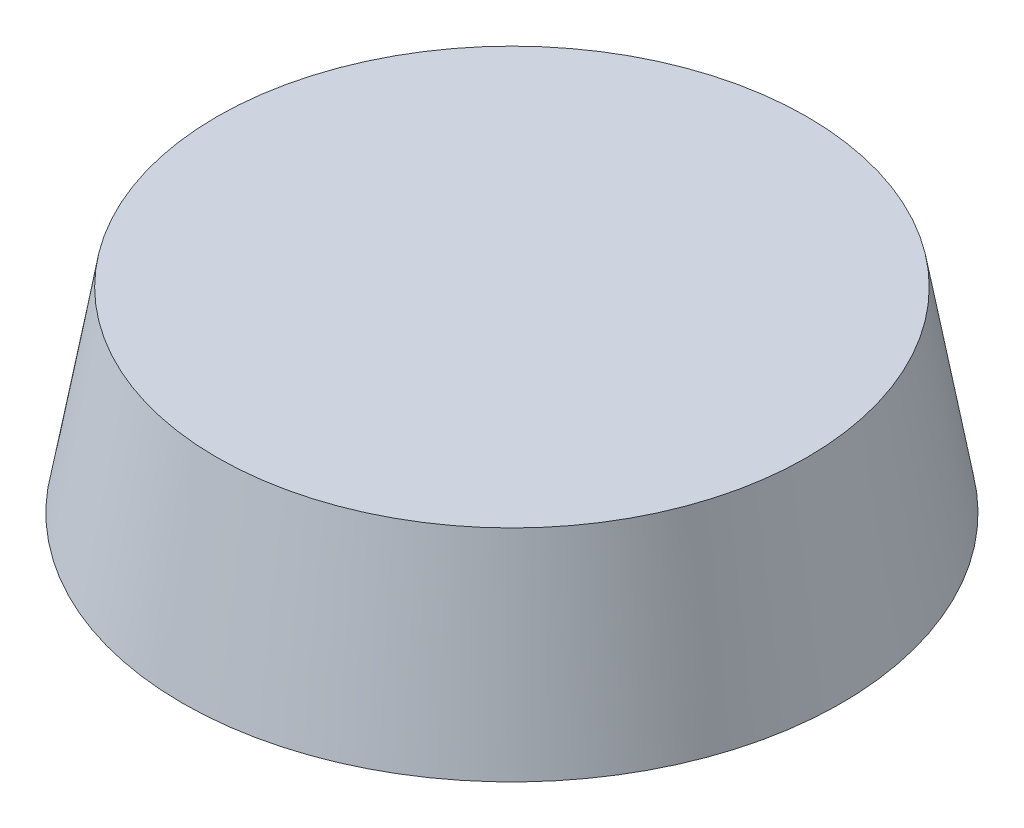
ISO-10303-21;
HEADER;
FILE_DESCRIPTION(('STEP AP214'),'2;1');
FILE_NAME('part.step','',(''),(''),'','','');
FILE_SCHEMA(('AUTOMOTIVE_DESIGN { 1 0 10303 214 1 1 1 1 }'));
ENDSEC;
DATA;
#1=APPLICATION_CONTEXT('core data for automotive mechanical design processes');
#2=APPLICATION_PROTOCOL_DEFINITION('international standard','automotive_design',2000,#1);
#3=PRODUCT_CONTEXT('',#1,'mechanical');
#4=PRODUCT('Part','Part','',(#3));
#5=PRODUCT_RELATED_PRODUCT_CATEGORY('part','',(#4));
#6=PRODUCT_DEFINITION_FORMATION('','',#4);
#7=PRODUCT_DEFINITION_CONTEXT('part definition',#1,'design');
#8=PRODUCT_DEFINITION('design','',#6,#7);
#9=PRODUCT_DEFINITION_SHAPE('','',#8);
#10=(LENGTH_UNIT() NAMED_UNIT(*) SI_UNIT(.MILLI.,.METRE.));
#11=(NAMED_UNIT(*) PLANE_ANGLE_UNIT() SI_UNIT($,.RADIAN.));
#12=(NAMED_UNIT(*) SI_UNIT($,.STERADIAN.) SOLID_ANGLE_UNIT());
#13=UNCERTAINTY_MEASURE_WITH_UNIT(LENGTH_MEASURE(1.E-05),#10,'distance_accuracy_value','');
#14=(GEOMETRIC_REPRESENTATION_CONTEXT(3) GLOBAL_UNCERTAINTY_ASSIGNED_CONTEXT((#13)) GLOBAL_UNIT_ASSIGNED_CONTEXT((#10,
#11,#12)) REPRESENTATION_CONTEXT('',''));
#15=CARTESIAN_POINT('',(0.,0.,0.));
#16=DIRECTION('',(0.,0.,1.));
#17=DIRECTION('',(1.,0.,0.));
#18=AXIS2_PLACEMENT_3D('',#15,#16,#17);
#19=CARTESIAN_POINT('',(0.,0.0868240888334607,0.));
#20=DIRECTION('',(0.,-1.,0.));
#21=DIRECTION('',(0.,0.,-1.));
#22=AXIS2_PLACEMENT_3D('',#19,#20,#21);
#23=PLANE('',#22);
#24=CARTESIAN_POINT('',(0.,0.0868240888334607,0.));
#25=DIRECTION('',(0.,-1.,0.));
#26=DIRECTION('',(0.,0.,-1.));
#27=AXIS2_PLACEMENT_3D('',#24,#25,#26);
#28=CIRCLE('',#27,11.9846905705632);
#29=CARTESIAN_POINT('',(0.,0.0868240888334607,-11.9846905705632));
#30=VERTEX_POINT('',#29);
#31=EDGE_CURVE('E36',#30,#30,#28,.F.);
#32=ORIENTED_EDGE('',*,*,#31,.T.);
#33=EDGE_LOOP('',(#32));
#34=FACE_BOUND('',#33,.T.);
#35=CARTESIAN_POINT('',(0.,0.0868240888334607,0.));
#36=DIRECTION('',(0.,1.,0.));
#37=DIRECTION('',(0.,0.,1.));
#38=AXIS2_PLACEMENT_3D('',#35,#36,#37);
#39=CIRCLE('',#38,12.4924038765061);
#40=CARTESIAN_POINT('',(0.,0.0868240888334607,12.4924038765061));
#41=VERTEX_POINT('',#40);
#42=EDGE_CURVE('E11',#41,#41,#39,.T.);
#43=ORIENTED_EDGE('',*,*,#42,.F.);
#44=EDGE_LOOP('',(#43));
#45=FACE_BOUND('',#44,.T.);
#46=ADVANCED_FACE('F32',(#34,#45),#23,.T.);
#47=CARTESIAN_POINT('',(0.,7.5,0.));
#48=DIRECTION('',(0.,1.,0.));
#49=DIRECTION('',(0.,0.,1.));
#50=AXIS2_PLACEMENT_3D('',#47,#48,#49);
#51=PLANE('',#50);
#52=CARTESIAN_POINT('',(0.,7.5,0.));
#53=DIRECTION('',(0.,1.,0.));
#54=DIRECTION('',(0.,0.,1.));
#55=AXIS2_PLACEMENT_3D('',#52,#53,#54);
#56=CIRCLE('',#55,11.1852609506294);
#57=CARTESIAN_POINT('',(0.,7.5,11.1852609506294));
#58=VERTEX_POINT('',#57);
#59=EDGE_CURVE('E44',#58,#58,#56,.T.);
#60=ORIENTED_EDGE('',*,*,#59,.T.);
#61=EDGE_LOOP('',(#60));
#62=FACE_BOUND('',#61,.T.);
#63=ADVANCED_FACE('F65',(#62),#51,.T.);
#64=CARTESIAN_POINT('',(0.,7.5,0.));
#65=DIRECTION('',(0.,-1.,0.));
#66=DIRECTION('',(0.,0.,-1.));
#67=AXIS2_PLACEMENT_3D('',#64,#65,#66);
#68=CONICAL_SURFACE('',#67,11.1852609506294,0.174532925199429);
#69=ORIENTED_EDGE('',*,*,#42,.T.);
#70=EDGE_LOOP('',(#69));
#71=FACE_BOUND('',#70,.T.);
#72=ORIENTED_EDGE('',*,*,#59,.F.);
#73=EDGE_LOOP('',(#72));
#74=FACE_BOUND('',#73,.T.);
#75=ADVANCED_FACE('F57',(#71,#74),#68,.T.);
#76=CARTESIAN_POINT('',(0.,7.,0.));
#77=DIRECTION('',(0.,-1.,0.));
#78=DIRECTION('',(0.,0.,-1.));
#79=AXIS2_PLACEMENT_3D('',#76,#77,#78);
#80=CONICAL_SURFACE('',#79,10.7657111350408,0.174532925199429);
#81=CARTESIAN_POINT('',(0.,7.,0.));
#82=DIRECTION('',(0.,1.,0.));
#83=DIRECTION('',(0.,0.,1.));
#84=AXIS2_PLACEMENT_3D('',#81,#82,#83);
#85=CIRCLE('',#84,10.7657111350408);
#86=CARTESIAN_POINT('',(0.,7.,10.7657111350408));
#87=VERTEX_POINT('',#86);
#88=EDGE_CURVE('E40',#87,#87,#85,.T.);
#89=ORIENTED_EDGE('',*,*,#88,.T.);
#90=EDGE_LOOP('',(#89));
#91=FACE_BOUND('',#90,.T.);
#92=ORIENTED_EDGE('',*,*,#31,.F.);
#93=EDGE_LOOP('',(#92));
#94=FACE_BOUND('',#93,.T.);
#95=ADVANCED_FACE('F34',(#91,#94),#80,.F.);
#96=CARTESIAN_POINT('',(0.,7.,0.));
#97=DIRECTION('',(0.,1.,0.));
#98=DIRECTION('',(0.,0.,1.));
#99=AXIS2_PLACEMENT_3D('',#96,#97,#98);
#100=PLANE('',#99);
#101=ORIENTED_EDGE('',*,*,#88,.F.);
#102=EDGE_LOOP('',(#101));
#103=FACE_BOUND('',#102,.T.);
#104=ADVANCED_FACE('F56',(#103),#100,.F.);
#105=CLOSED_SHELL('',(#46,#63,#75,#95,#104));
#106=MANIFOLD_SOLID_BREP('B2',#105);
#107=ADVANCED_BREP_SHAPE_REPRESENTATION('',(#18,#106),#14);
#108=SHAPE_DEFINITION_REPRESENTATION(#9,#107);
ENDSEC;
END-ISO-10303-21;
